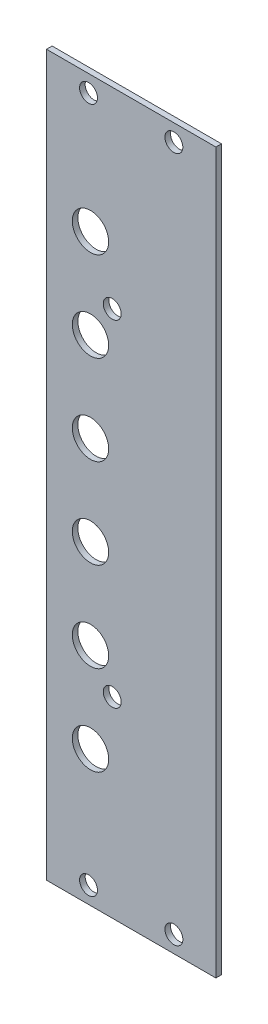
ISO-10303-21;
HEADER;
FILE_DESCRIPTION(('STEP AP214'),'2;1');
FILE_NAME('part.step','',(''),(''),'','','');
FILE_SCHEMA(('AUTOMOTIVE_DESIGN { 1 0 10303 214 1 1 1 1 }'));
ENDSEC;
DATA;
#1=APPLICATION_CONTEXT('core data for automotive mechanical design processes');
#2=APPLICATION_PROTOCOL_DEFINITION('international standard','automotive_design',2000,#1);
#3=PRODUCT_CONTEXT('',#1,'mechanical');
#4=PRODUCT('Part','Part','',(#3));
#5=PRODUCT_RELATED_PRODUCT_CATEGORY('part','',(#4));
#6=PRODUCT_DEFINITION_FORMATION('','',#4);
#7=PRODUCT_DEFINITION_CONTEXT('part definition',#1,'design');
#8=PRODUCT_DEFINITION('design','',#6,#7);
#9=PRODUCT_DEFINITION_SHAPE('','',#8);
#10=(LENGTH_UNIT() NAMED_UNIT(*) SI_UNIT(.MILLI.,.METRE.));
#11=(NAMED_UNIT(*) PLANE_ANGLE_UNIT() SI_UNIT($,.RADIAN.));
#12=(NAMED_UNIT(*) SI_UNIT($,.STERADIAN.) SOLID_ANGLE_UNIT());
#13=UNCERTAINTY_MEASURE_WITH_UNIT(LENGTH_MEASURE(1.E-05),#10,'distance_accuracy_value','');
#14=(GEOMETRIC_REPRESENTATION_CONTEXT(3) GLOBAL_UNCERTAINTY_ASSIGNED_CONTEXT((#13)) GLOBAL_UNIT_ASSIGNED_CONTEXT((#10,
#11,#12)) REPRESENTATION_CONTEXT('',''));
#15=CARTESIAN_POINT('',(0.,0.,0.));
#16=DIRECTION('',(0.,0.,1.));
#17=DIRECTION('',(1.,0.,0.));
#18=AXIS2_PLACEMENT_3D('',#15,#16,#17);
#19=CARTESIAN_POINT('',(0.,0.,1.));
#20=DIRECTION('',(0.,1.,0.));
#21=DIRECTION('',(0.,0.,1.));
#22=AXIS2_PLACEMENT_3D('',#19,#20,#21);
#23=PLANE('',#22);
#24=DIRECTION('',(1.,0.,0.));
#25=VECTOR('',#24,1.);
#26=CARTESIAN_POINT('',(0.,0.,0.));
#27=LINE('',#26,#25);
#28=CARTESIAN_POINT('',(0.,0.,0.));
#29=VERTEX_POINT('',#28);
#30=CARTESIAN_POINT('',(30.24,0.,0.));
#31=VERTEX_POINT('',#30);
#32=EDGE_CURVE('E127',#29,#31,#27,.T.);
#33=ORIENTED_EDGE('',*,*,#32,.T.);
#34=DIRECTION('',(0.,0.,-1.));
#35=VECTOR('',#34,1.);
#36=CARTESIAN_POINT('',(30.24,0.,1.));
#37=LINE('',#36,#35);
#38=CARTESIAN_POINT('',(30.24,0.,1.));
#39=VERTEX_POINT('',#38);
#40=EDGE_CURVE('E11',#39,#31,#37,.T.);
#41=ORIENTED_EDGE('',*,*,#40,.F.);
#42=DIRECTION('',(1.,0.,0.));
#43=VECTOR('',#42,1.);
#44=CARTESIAN_POINT('',(0.,0.,1.));
#45=LINE('',#44,#43);
#46=CARTESIAN_POINT('',(0.,0.,1.));
#47=VERTEX_POINT('',#46);
#48=EDGE_CURVE('E92',#47,#39,#45,.T.);
#49=ORIENTED_EDGE('',*,*,#48,.F.);
#50=DIRECTION('',(0.,0.,-1.));
#51=VECTOR('',#50,1.);
#52=CARTESIAN_POINT('',(0.,0.,1.));
#53=LINE('',#52,#51);
#54=EDGE_CURVE('E59',#47,#29,#53,.T.);
#55=ORIENTED_EDGE('',*,*,#54,.T.);
#56=EDGE_LOOP('',(#33,#41,#49,#55));
#57=FACE_BOUND('',#56,.T.);
#58=ADVANCED_FACE('F41',(#57),#23,.F.);
#59=CARTESIAN_POINT('',(30.24,0.,1.));
#60=DIRECTION('',(-1.,0.,0.));
#61=DIRECTION('',(0.,0.,1.));
#62=AXIS2_PLACEMENT_3D('',#59,#60,#61);
#63=PLANE('',#62);
#64=DIRECTION('',(0.,1.,0.));
#65=VECTOR('',#64,1.);
#66=CARTESIAN_POINT('',(30.24,0.,0.));
#67=LINE('',#66,#65);
#68=CARTESIAN_POINT('',(30.24,128.5,0.));
#69=VERTEX_POINT('',#68);
#70=EDGE_CURVE('E98',#31,#69,#67,.T.);
#71=ORIENTED_EDGE('',*,*,#70,.T.);
#72=DIRECTION('',(0.,0.,-1.));
#73=VECTOR('',#72,1.);
#74=CARTESIAN_POINT('',(30.24,128.5,1.));
#75=LINE('',#74,#73);
#76=CARTESIAN_POINT('',(30.24,128.5,1.));
#77=VERTEX_POINT('',#76);
#78=EDGE_CURVE('E51',#77,#69,#75,.T.);
#79=ORIENTED_EDGE('',*,*,#78,.F.);
#80=DIRECTION('',(0.,1.,0.));
#81=VECTOR('',#80,1.);
#82=CARTESIAN_POINT('',(30.24,0.,1.));
#83=LINE('',#82,#81);
#84=EDGE_CURVE('E84',#39,#77,#83,.T.);
#85=ORIENTED_EDGE('',*,*,#84,.F.);
#86=ORIENTED_EDGE('',*,*,#40,.T.);
#87=EDGE_LOOP('',(#71,#79,#85,#86));
#88=FACE_BOUND('',#87,.T.);
#89=ADVANCED_FACE('F97',(#88),#63,.F.);
#90=CARTESIAN_POINT('',(0.,128.5,1.));
#91=DIRECTION('',(0.,1.,0.));
#92=DIRECTION('',(0.,0.,1.));
#93=AXIS2_PLACEMENT_3D('',#90,#91,#92);
#94=PLANE('',#93);
#95=DIRECTION('',(1.,0.,0.));
#96=VECTOR('',#95,1.);
#97=CARTESIAN_POINT('',(0.,128.5,0.));
#98=LINE('',#97,#96);
#99=CARTESIAN_POINT('',(0.,128.5,0.));
#100=VERTEX_POINT('',#99);
#101=EDGE_CURVE('E132',#100,#69,#98,.T.);
#102=ORIENTED_EDGE('',*,*,#101,.F.);
#103=DIRECTION('',(0.,0.,-1.));
#104=VECTOR('',#103,1.);
#105=CARTESIAN_POINT('',(0.,128.5,1.));
#106=LINE('',#105,#104);
#107=CARTESIAN_POINT('',(0.,128.5,1.));
#108=VERTEX_POINT('',#107);
#109=EDGE_CURVE('E73',#108,#100,#106,.T.);
#110=ORIENTED_EDGE('',*,*,#109,.F.);
#111=DIRECTION('',(1.,0.,0.));
#112=VECTOR('',#111,1.);
#113=CARTESIAN_POINT('',(0.,128.5,1.));
#114=LINE('',#113,#112);
#115=EDGE_CURVE('E91',#108,#77,#114,.T.);
#116=ORIENTED_EDGE('',*,*,#115,.T.);
#117=ORIENTED_EDGE('',*,*,#78,.T.);
#118=EDGE_LOOP('',(#102,#110,#116,#117));
#119=FACE_BOUND('',#118,.T.);
#120=ADVANCED_FACE('F102',(#119),#94,.T.);
#121=CARTESIAN_POINT('',(7.49999999999999,125.5,1.));
#122=DIRECTION('',(0.,0.,-1.));
#123=DIRECTION('',(-1.,0.,0.));
#124=AXIS2_PLACEMENT_3D('',#121,#122,#123);
#125=CYLINDRICAL_SURFACE('',#124,1.6);
#126=CARTESIAN_POINT('',(7.49999999999999,125.5,1.));
#127=DIRECTION('',(0.,0.,1.));
#128=DIRECTION('',(1.,0.,0.));
#129=AXIS2_PLACEMENT_3D('',#126,#127,#128);
#130=CIRCLE('',#129,1.6);
#131=CARTESIAN_POINT('',(9.09999999999999,125.5,1.));
#132=VERTEX_POINT('',#131);
#133=EDGE_CURVE('E160',#132,#132,#130,.T.);
#134=ORIENTED_EDGE('',*,*,#133,.T.);
#135=EDGE_LOOP('',(#134));
#136=FACE_BOUND('',#135,.T.);
#137=CARTESIAN_POINT('',(7.49999999999999,125.5,0.));
#138=DIRECTION('',(0.,0.,1.));
#139=DIRECTION('',(1.,0.,0.));
#140=AXIS2_PLACEMENT_3D('',#137,#138,#139);
#141=CIRCLE('',#140,1.6);
#142=CARTESIAN_POINT('',(9.09999999999999,125.5,0.));
#143=VERTEX_POINT('',#142);
#144=EDGE_CURVE('E123',#143,#143,#141,.T.);
#145=ORIENTED_EDGE('',*,*,#144,.F.);
#146=EDGE_LOOP('',(#145));
#147=FACE_BOUND('',#146,.T.);
#148=ADVANCED_FACE('F166',(#136,#147),#125,.F.);
#149=CARTESIAN_POINT('',(22.74,125.5,1.));
#150=DIRECTION('',(0.,0.,-1.));
#151=DIRECTION('',(-1.,0.,0.));
#152=AXIS2_PLACEMENT_3D('',#149,#150,#151);
#153=CYLINDRICAL_SURFACE('',#152,1.59999999999999);
#154=CARTESIAN_POINT('',(22.74,125.5,1.));
#155=DIRECTION('',(0.,0.,1.));
#156=DIRECTION('',(1.,0.,0.));
#157=AXIS2_PLACEMENT_3D('',#154,#155,#156);
#158=CIRCLE('',#157,1.59999999999999);
#159=CARTESIAN_POINT('',(24.34,125.5,1.));
#160=VERTEX_POINT('',#159);
#161=EDGE_CURVE('E152',#160,#160,#158,.T.);
#162=ORIENTED_EDGE('',*,*,#161,.T.);
#163=EDGE_LOOP('',(#162));
#164=FACE_BOUND('',#163,.T.);
#165=CARTESIAN_POINT('',(22.74,125.5,0.));
#166=DIRECTION('',(0.,0.,1.));
#167=DIRECTION('',(1.,0.,0.));
#168=AXIS2_PLACEMENT_3D('',#165,#166,#167);
#169=CIRCLE('',#168,1.59999999999999);
#170=CARTESIAN_POINT('',(24.34,125.5,0.));
#171=VERTEX_POINT('',#170);
#172=EDGE_CURVE('E119',#171,#171,#169,.T.);
#173=ORIENTED_EDGE('',*,*,#172,.F.);
#174=EDGE_LOOP('',(#173));
#175=FACE_BOUND('',#174,.T.);
#176=ADVANCED_FACE('F195',(#164,#175),#153,.F.);
#177=CARTESIAN_POINT('',(22.74,3.,1.));
#178=DIRECTION('',(0.,0.,-1.));
#179=DIRECTION('',(-1.,0.,0.));
#180=AXIS2_PLACEMENT_3D('',#177,#178,#179);
#181=CYLINDRICAL_SURFACE('',#180,1.60000000000001);
#182=CARTESIAN_POINT('',(22.74,3.,1.));
#183=DIRECTION('',(0.,0.,1.));
#184=DIRECTION('',(1.,0.,0.));
#185=AXIS2_PLACEMENT_3D('',#182,#183,#184);
#186=CIRCLE('',#185,1.60000000000001);
#187=CARTESIAN_POINT('',(24.34,3.,1.));
#188=VERTEX_POINT('',#187);
#189=EDGE_CURVE('E146',#188,#188,#186,.T.);
#190=ORIENTED_EDGE('',*,*,#189,.T.);
#191=EDGE_LOOP('',(#190));
#192=FACE_BOUND('',#191,.T.);
#193=CARTESIAN_POINT('',(22.74,3.,0.));
#194=DIRECTION('',(0.,0.,1.));
#195=DIRECTION('',(1.,0.,0.));
#196=AXIS2_PLACEMENT_3D('',#193,#194,#195);
#197=CIRCLE('',#196,1.60000000000001);
#198=CARTESIAN_POINT('',(24.34,3.,0.));
#199=VERTEX_POINT('',#198);
#200=EDGE_CURVE('E114',#199,#199,#197,.T.);
#201=ORIENTED_EDGE('',*,*,#200,.F.);
#202=EDGE_LOOP('',(#201));
#203=FACE_BOUND('',#202,.T.);
#204=ADVANCED_FACE('F197',(#192,#203),#181,.F.);
#205=CARTESIAN_POINT('',(7.50000000000001,3.,1.));
#206=DIRECTION('',(0.,0.,-1.));
#207=DIRECTION('',(-1.,0.,0.));
#208=AXIS2_PLACEMENT_3D('',#205,#206,#207);
#209=CYLINDRICAL_SURFACE('',#208,1.6);
#210=CARTESIAN_POINT('',(7.50000000000001,3.,1.));
#211=DIRECTION('',(0.,0.,1.));
#212=DIRECTION('',(1.,0.,0.));
#213=AXIS2_PLACEMENT_3D('',#210,#211,#212);
#214=CIRCLE('',#213,1.6);
#215=CARTESIAN_POINT('',(9.10000000000001,3.,1.));
#216=VERTEX_POINT('',#215);
#217=EDGE_CURVE('E139',#216,#216,#214,.T.);
#218=ORIENTED_EDGE('',*,*,#217,.T.);
#219=EDGE_LOOP('',(#218));
#220=FACE_BOUND('',#219,.T.);
#221=CARTESIAN_POINT('',(7.50000000000001,3.,0.));
#222=DIRECTION('',(0.,0.,1.));
#223=DIRECTION('',(1.,0.,0.));
#224=AXIS2_PLACEMENT_3D('',#221,#222,#223);
#225=CIRCLE('',#224,1.6);
#226=CARTESIAN_POINT('',(9.10000000000001,3.,0.));
#227=VERTEX_POINT('',#226);
#228=EDGE_CURVE('E110',#227,#227,#225,.T.);
#229=ORIENTED_EDGE('',*,*,#228,.F.);
#230=EDGE_LOOP('',(#229));
#231=FACE_BOUND('',#230,.T.);
#232=ADVANCED_FACE('F43',(#220,#231),#209,.F.);
#233=CARTESIAN_POINT('',(0.,0.,1.));
#234=DIRECTION('',(-1.,0.,0.));
#235=DIRECTION('',(0.,0.,1.));
#236=AXIS2_PLACEMENT_3D('',#233,#234,#235);
#237=PLANE('',#236);
#238=DIRECTION('',(0.,1.,0.));
#239=VECTOR('',#238,1.);
#240=CARTESIAN_POINT('',(0.,0.,0.));
#241=LINE('',#240,#239);
#242=EDGE_CURVE('E135',#29,#100,#241,.T.);
#243=ORIENTED_EDGE('',*,*,#242,.F.);
#244=ORIENTED_EDGE('',*,*,#54,.F.);
#245=DIRECTION('',(0.,1.,0.));
#246=VECTOR('',#245,1.);
#247=CARTESIAN_POINT('',(0.,0.,1.));
#248=LINE('',#247,#246);
#249=EDGE_CURVE('E104',#47,#108,#248,.T.);
#250=ORIENTED_EDGE('',*,*,#249,.T.);
#251=ORIENTED_EDGE('',*,*,#109,.T.);
#252=EDGE_LOOP('',(#243,#244,#250,#251));
#253=FACE_BOUND('',#252,.T.);
#254=ADVANCED_FACE('F171',(#253),#237,.T.);
#255=CARTESIAN_POINT('',(0.,0.,1.));
#256=DIRECTION('',(0.,0.,1.));
#257=DIRECTION('',(1.,0.,0.));
#258=AXIS2_PLACEMENT_3D('',#255,#256,#257);
#259=PLANE('',#258);
#260=CARTESIAN_POINT('',(11.7314000000001,94.225,1.));
#261=DIRECTION('',(0.,0.,1.));
#262=DIRECTION('',(1.,0.,0.));
#263=AXIS2_PLACEMENT_3D('',#260,#261,#262);
#264=CIRCLE('',#263,1.6);
#265=CARTESIAN_POINT('',(13.3314000000001,94.225,1.));
#266=VERTEX_POINT('',#265);
#267=EDGE_CURVE('E319',#266,#266,#264,.T.);
#268=ORIENTED_EDGE('',*,*,#267,.F.);
#269=EDGE_LOOP('',(#268));
#270=FACE_BOUND('',#269,.T.);
#271=CARTESIAN_POINT('',(11.7314000000001,34.225,1.));
#272=DIRECTION('',(0.,0.,1.));
#273=DIRECTION('',(1.,0.,0.));
#274=AXIS2_PLACEMENT_3D('',#271,#272,#273);
#275=CIRCLE('',#274,1.6);
#276=CARTESIAN_POINT('',(13.3314000000001,34.225,1.));
#277=VERTEX_POINT('',#276);
#278=EDGE_CURVE('E324',#277,#277,#275,.T.);
#279=ORIENTED_EDGE('',*,*,#278,.F.);
#280=EDGE_LOOP('',(#279));
#281=FACE_BOUND('',#280,.T.);
#282=CARTESIAN_POINT('',(7.85000000000007,104.25,1.));
#283=DIRECTION('',(0.,0.,1.));
#284=DIRECTION('',(1.,0.,0.));
#285=AXIS2_PLACEMENT_3D('',#282,#283,#284);
#286=CIRCLE('',#285,3.25);
#287=CARTESIAN_POINT('',(11.1000000000001,104.25,1.));
#288=VERTEX_POINT('',#287);
#289=EDGE_CURVE('E115',#288,#288,#286,.T.);
#290=ORIENTED_EDGE('',*,*,#289,.F.);
#291=EDGE_LOOP('',(#290));
#292=FACE_BOUND('',#291,.T.);
#293=CARTESIAN_POINT('',(7.85000000000024,88.25,1.));
#294=DIRECTION('',(0.,0.,1.));
#295=DIRECTION('',(1.,0.,0.));
#296=AXIS2_PLACEMENT_3D('',#293,#294,#295);
#297=CIRCLE('',#296,3.25);
#298=CARTESIAN_POINT('',(11.1000000000002,88.25,1.));
#299=VERTEX_POINT('',#298);
#300=EDGE_CURVE('E375',#299,#299,#297,.T.);
#301=ORIENTED_EDGE('',*,*,#300,.F.);
#302=EDGE_LOOP('',(#301));
#303=FACE_BOUND('',#302,.T.);
#304=CARTESIAN_POINT('',(7.8500000000004,72.25,1.));
#305=DIRECTION('',(0.,0.,1.));
#306=DIRECTION('',(1.,0.,0.));
#307=AXIS2_PLACEMENT_3D('',#304,#305,#306);
#308=CIRCLE('',#307,3.25);
#309=CARTESIAN_POINT('',(11.1000000000004,72.25,1.));
#310=VERTEX_POINT('',#309);
#311=EDGE_CURVE('E372',#310,#310,#308,.T.);
#312=ORIENTED_EDGE('',*,*,#311,.F.);
#313=EDGE_LOOP('',(#312));
#314=FACE_BOUND('',#313,.T.);
#315=CARTESIAN_POINT('',(7.85000000000057,56.25,1.));
#316=DIRECTION('',(0.,0.,1.));
#317=DIRECTION('',(1.,0.,0.));
#318=AXIS2_PLACEMENT_3D('',#315,#316,#317);
#319=CIRCLE('',#318,3.25);
#320=CARTESIAN_POINT('',(11.1000000000006,56.25,1.));
#321=VERTEX_POINT('',#320);
#322=EDGE_CURVE('E368',#321,#321,#319,.T.);
#323=ORIENTED_EDGE('',*,*,#322,.F.);
#324=EDGE_LOOP('',(#323));
#325=FACE_BOUND('',#324,.T.);
#326=CARTESIAN_POINT('',(7.85000000000074,40.25,1.));
#327=DIRECTION('',(0.,0.,1.));
#328=DIRECTION('',(1.,0.,0.));
#329=AXIS2_PLACEMENT_3D('',#326,#327,#328);
#330=CIRCLE('',#329,3.25);
#331=CARTESIAN_POINT('',(11.1000000000007,40.25,1.));
#332=VERTEX_POINT('',#331);
#333=EDGE_CURVE('E364',#332,#332,#330,.T.);
#334=ORIENTED_EDGE('',*,*,#333,.F.);
#335=EDGE_LOOP('',(#334));
#336=FACE_BOUND('',#335,.T.);
#337=CARTESIAN_POINT('',(7.8500000000009,24.25,1.));
#338=DIRECTION('',(0.,0.,1.));
#339=DIRECTION('',(1.,0.,0.));
#340=AXIS2_PLACEMENT_3D('',#337,#338,#339);
#341=CIRCLE('',#340,3.25);
#342=CARTESIAN_POINT('',(11.1000000000009,24.25,1.));
#343=VERTEX_POINT('',#342);
#344=EDGE_CURVE('E341',#343,#343,#341,.T.);
#345=ORIENTED_EDGE('',*,*,#344,.F.);
#346=EDGE_LOOP('',(#345));
#347=FACE_BOUND('',#346,.T.);
#348=ORIENTED_EDGE('',*,*,#217,.F.);
#349=EDGE_LOOP('',(#348));
#350=FACE_BOUND('',#349,.T.);
#351=ORIENTED_EDGE('',*,*,#189,.F.);
#352=EDGE_LOOP('',(#351));
#353=FACE_BOUND('',#352,.T.);
#354=ORIENTED_EDGE('',*,*,#161,.F.);
#355=EDGE_LOOP('',(#354));
#356=FACE_BOUND('',#355,.T.);
#357=ORIENTED_EDGE('',*,*,#133,.F.);
#358=EDGE_LOOP('',(#357));
#359=FACE_BOUND('',#358,.T.);
#360=ORIENTED_EDGE('',*,*,#48,.T.);
#361=ORIENTED_EDGE('',*,*,#84,.T.);
#362=ORIENTED_EDGE('',*,*,#115,.F.);
#363=ORIENTED_EDGE('',*,*,#249,.F.);
#364=EDGE_LOOP('',(#360,#361,#362,#363));
#365=FACE_BOUND('',#364,.T.);
#366=ADVANCED_FACE('F88',(#270,#281,#292,#303,#314,#325,#336,#347,#350,#353,#356,#359,#365),
#259,.T.);
#367=CARTESIAN_POINT('',(0.,0.,0.));
#368=DIRECTION('',(0.,0.,1.));
#369=DIRECTION('',(1.,0.,0.));
#370=AXIS2_PLACEMENT_3D('',#367,#368,#369);
#371=PLANE('',#370);
#372=CARTESIAN_POINT('',(11.7314000000001,94.225,0.));
#373=DIRECTION('',(0.,0.,1.));
#374=DIRECTION('',(1.,0.,0.));
#375=AXIS2_PLACEMENT_3D('',#372,#373,#374);
#376=CIRCLE('',#375,1.6);
#377=CARTESIAN_POINT('',(13.3314000000001,94.225,0.));
#378=VERTEX_POINT('',#377);
#379=EDGE_CURVE('E322',#378,#378,#376,.T.);
#380=ORIENTED_EDGE('',*,*,#379,.T.);
#381=EDGE_LOOP('',(#380));
#382=FACE_BOUND('',#381,.T.);
#383=CARTESIAN_POINT('',(11.7314000000001,34.225,0.));
#384=DIRECTION('',(0.,0.,1.));
#385=DIRECTION('',(1.,0.,0.));
#386=AXIS2_PLACEMENT_3D('',#383,#384,#385);
#387=CIRCLE('',#386,1.6);
#388=CARTESIAN_POINT('',(13.3314000000001,34.225,0.));
#389=VERTEX_POINT('',#388);
#390=EDGE_CURVE('E325',#389,#389,#387,.T.);
#391=ORIENTED_EDGE('',*,*,#390,.T.);
#392=EDGE_LOOP('',(#391));
#393=FACE_BOUND('',#392,.T.);
#394=CARTESIAN_POINT('',(7.85000000000007,104.25,0.));
#395=DIRECTION('',(0.,0.,1.));
#396=DIRECTION('',(1.,0.,0.));
#397=AXIS2_PLACEMENT_3D('',#394,#395,#396);
#398=CIRCLE('',#397,3.25);
#399=CARTESIAN_POINT('',(11.1000000000001,104.25,0.));
#400=VERTEX_POINT('',#399);
#401=EDGE_CURVE('E337',#400,#400,#398,.T.);
#402=ORIENTED_EDGE('',*,*,#401,.T.);
#403=EDGE_LOOP('',(#402));
#404=FACE_BOUND('',#403,.T.);
#405=CARTESIAN_POINT('',(7.85000000000024,88.25,0.));
#406=DIRECTION('',(0.,0.,1.));
#407=DIRECTION('',(1.,0.,0.));
#408=AXIS2_PLACEMENT_3D('',#405,#406,#407);
#409=CIRCLE('',#408,3.25);
#410=CARTESIAN_POINT('',(11.1000000000002,88.25,0.));
#411=VERTEX_POINT('',#410);
#412=EDGE_CURVE('E342',#411,#411,#409,.T.);
#413=ORIENTED_EDGE('',*,*,#412,.T.);
#414=EDGE_LOOP('',(#413));
#415=FACE_BOUND('',#414,.T.);
#416=CARTESIAN_POINT('',(7.8500000000004,72.25,0.));
#417=DIRECTION('',(0.,0.,1.));
#418=DIRECTION('',(1.,0.,0.));
#419=AXIS2_PLACEMENT_3D('',#416,#417,#418);
#420=CIRCLE('',#419,3.25);
#421=CARTESIAN_POINT('',(11.1000000000004,72.25,0.));
#422=VERTEX_POINT('',#421);
#423=EDGE_CURVE('E346',#422,#422,#420,.T.);
#424=ORIENTED_EDGE('',*,*,#423,.T.);
#425=EDGE_LOOP('',(#424));
#426=FACE_BOUND('',#425,.T.);
#427=CARTESIAN_POINT('',(7.85000000000057,56.25,0.));
#428=DIRECTION('',(0.,0.,1.));
#429=DIRECTION('',(1.,0.,0.));
#430=AXIS2_PLACEMENT_3D('',#427,#428,#429);
#431=CIRCLE('',#430,3.25);
#432=CARTESIAN_POINT('',(11.1000000000006,56.25,0.));
#433=VERTEX_POINT('',#432);
#434=EDGE_CURVE('E350',#433,#433,#431,.T.);
#435=ORIENTED_EDGE('',*,*,#434,.T.);
#436=EDGE_LOOP('',(#435));
#437=FACE_BOUND('',#436,.T.);
#438=CARTESIAN_POINT('',(7.85000000000074,40.25,0.));
#439=DIRECTION('',(0.,0.,1.));
#440=DIRECTION('',(1.,0.,0.));
#441=AXIS2_PLACEMENT_3D('',#438,#439,#440);
#442=CIRCLE('',#441,3.25);
#443=CARTESIAN_POINT('',(11.1000000000007,40.25,0.));
#444=VERTEX_POINT('',#443);
#445=EDGE_CURVE('E354',#444,#444,#442,.T.);
#446=ORIENTED_EDGE('',*,*,#445,.T.);
#447=EDGE_LOOP('',(#446));
#448=FACE_BOUND('',#447,.T.);
#449=CARTESIAN_POINT('',(7.8500000000009,24.25,0.));
#450=DIRECTION('',(0.,0.,1.));
#451=DIRECTION('',(1.,0.,0.));
#452=AXIS2_PLACEMENT_3D('',#449,#450,#451);
#453=CIRCLE('',#452,3.25);
#454=CARTESIAN_POINT('',(11.1000000000009,24.25,0.));
#455=VERTEX_POINT('',#454);
#456=EDGE_CURVE('E336',#455,#455,#453,.T.);
#457=ORIENTED_EDGE('',*,*,#456,.T.);
#458=EDGE_LOOP('',(#457));
#459=FACE_BOUND('',#458,.T.);
#460=ORIENTED_EDGE('',*,*,#228,.T.);
#461=EDGE_LOOP('',(#460));
#462=FACE_BOUND('',#461,.T.);
#463=ORIENTED_EDGE('',*,*,#200,.T.);
#464=EDGE_LOOP('',(#463));
#465=FACE_BOUND('',#464,.T.);
#466=ORIENTED_EDGE('',*,*,#172,.T.);
#467=EDGE_LOOP('',(#466));
#468=FACE_BOUND('',#467,.T.);
#469=ORIENTED_EDGE('',*,*,#144,.T.);
#470=EDGE_LOOP('',(#469));
#471=FACE_BOUND('',#470,.T.);
#472=ORIENTED_EDGE('',*,*,#32,.F.);
#473=ORIENTED_EDGE('',*,*,#242,.T.);
#474=ORIENTED_EDGE('',*,*,#101,.T.);
#475=ORIENTED_EDGE('',*,*,#70,.F.);
#476=EDGE_LOOP('',(#472,#473,#474,#475));
#477=FACE_BOUND('',#476,.T.);
#478=ADVANCED_FACE('F170',(#382,#393,#404,#415,#426,#437,#448,#459,#462,#465,#468,#471,#477),
#371,.F.);
#479=CARTESIAN_POINT('',(7.8500000000009,24.25,0.));
#480=DIRECTION('',(0.,0.,1.));
#481=DIRECTION('',(1.,0.,0.));
#482=AXIS2_PLACEMENT_3D('',#479,#480,#481);
#483=CYLINDRICAL_SURFACE('',#482,3.25);
#484=ORIENTED_EDGE('',*,*,#344,.T.);
#485=EDGE_LOOP('',(#484));
#486=FACE_BOUND('',#485,.T.);
#487=ORIENTED_EDGE('',*,*,#456,.F.);
#488=EDGE_LOOP('',(#487));
#489=FACE_BOUND('',#488,.T.);
#490=ADVANCED_FACE('F178',(#486,#489),#483,.F.);
#491=CARTESIAN_POINT('',(7.85000000000074,40.25,0.));
#492=DIRECTION('',(0.,0.,1.));
#493=DIRECTION('',(1.,0.,0.));
#494=AXIS2_PLACEMENT_3D('',#491,#492,#493);
#495=CYLINDRICAL_SURFACE('',#494,3.25);
#496=ORIENTED_EDGE('',*,*,#333,.T.);
#497=EDGE_LOOP('',(#496));
#498=FACE_BOUND('',#497,.T.);
#499=ORIENTED_EDGE('',*,*,#445,.F.);
#500=EDGE_LOOP('',(#499));
#501=FACE_BOUND('',#500,.T.);
#502=ADVANCED_FACE('F235',(#498,#501),#495,.F.);
#503=CARTESIAN_POINT('',(7.85000000000057,56.25,0.));
#504=DIRECTION('',(0.,0.,1.));
#505=DIRECTION('',(1.,0.,0.));
#506=AXIS2_PLACEMENT_3D('',#503,#504,#505);
#507=CYLINDRICAL_SURFACE('',#506,3.25);
#508=ORIENTED_EDGE('',*,*,#322,.T.);
#509=EDGE_LOOP('',(#508));
#510=FACE_BOUND('',#509,.T.);
#511=ORIENTED_EDGE('',*,*,#434,.F.);
#512=EDGE_LOOP('',(#511));
#513=FACE_BOUND('',#512,.T.);
#514=ADVANCED_FACE('F245',(#510,#513),#507,.F.);
#515=CARTESIAN_POINT('',(7.8500000000004,72.25,0.));
#516=DIRECTION('',(0.,0.,1.));
#517=DIRECTION('',(1.,0.,0.));
#518=AXIS2_PLACEMENT_3D('',#515,#516,#517);
#519=CYLINDRICAL_SURFACE('',#518,3.25);
#520=ORIENTED_EDGE('',*,*,#311,.T.);
#521=EDGE_LOOP('',(#520));
#522=FACE_BOUND('',#521,.T.);
#523=ORIENTED_EDGE('',*,*,#423,.F.);
#524=EDGE_LOOP('',(#523));
#525=FACE_BOUND('',#524,.T.);
#526=ADVANCED_FACE('F255',(#522,#525),#519,.F.);
#527=CARTESIAN_POINT('',(7.85000000000024,88.25,0.));
#528=DIRECTION('',(0.,0.,1.));
#529=DIRECTION('',(1.,0.,0.));
#530=AXIS2_PLACEMENT_3D('',#527,#528,#529);
#531=CYLINDRICAL_SURFACE('',#530,3.25);
#532=ORIENTED_EDGE('',*,*,#300,.T.);
#533=EDGE_LOOP('',(#532));
#534=FACE_BOUND('',#533,.T.);
#535=ORIENTED_EDGE('',*,*,#412,.F.);
#536=EDGE_LOOP('',(#535));
#537=FACE_BOUND('',#536,.T.);
#538=ADVANCED_FACE('F265',(#534,#537),#531,.F.);
#539=CARTESIAN_POINT('',(7.85000000000007,104.25,0.));
#540=DIRECTION('',(0.,0.,1.));
#541=DIRECTION('',(1.,0.,0.));
#542=AXIS2_PLACEMENT_3D('',#539,#540,#541);
#543=CYLINDRICAL_SURFACE('',#542,3.25);
#544=ORIENTED_EDGE('',*,*,#289,.T.);
#545=EDGE_LOOP('',(#544));
#546=FACE_BOUND('',#545,.T.);
#547=ORIENTED_EDGE('',*,*,#401,.F.);
#548=EDGE_LOOP('',(#547));
#549=FACE_BOUND('',#548,.T.);
#550=ADVANCED_FACE('F275',(#546,#549),#543,.F.);
#551=CARTESIAN_POINT('',(11.7314000000001,34.225,0.));
#552=DIRECTION('',(0.,0.,1.));
#553=DIRECTION('',(1.,0.,0.));
#554=AXIS2_PLACEMENT_3D('',#551,#552,#553);
#555=CYLINDRICAL_SURFACE('',#554,1.6);
#556=ORIENTED_EDGE('',*,*,#278,.T.);
#557=EDGE_LOOP('',(#556));
#558=FACE_BOUND('',#557,.T.);
#559=ORIENTED_EDGE('',*,*,#390,.F.);
#560=EDGE_LOOP('',(#559));
#561=FACE_BOUND('',#560,.T.);
#562=ADVANCED_FACE('F284',(#558,#561),#555,.F.);
#563=CARTESIAN_POINT('',(11.7314000000001,94.225,0.));
#564=DIRECTION('',(0.,0.,1.));
#565=DIRECTION('',(1.,0.,0.));
#566=AXIS2_PLACEMENT_3D('',#563,#564,#565);
#567=CYLINDRICAL_SURFACE('',#566,1.6);
#568=ORIENTED_EDGE('',*,*,#267,.T.);
#569=EDGE_LOOP('',(#568));
#570=FACE_BOUND('',#569,.T.);
#571=ORIENTED_EDGE('',*,*,#379,.F.);
#572=EDGE_LOOP('',(#571));
#573=FACE_BOUND('',#572,.T.);
#574=ADVANCED_FACE('F303',(#570,#573),#567,.F.);
#575=CLOSED_SHELL('',(#58,#89,#120,#148,#176,#204,#232,#254,#366,#478,#490,#502,#514,#526,#538,
#550,#562,#574));
#576=MANIFOLD_SOLID_BREP('B2',#575);
#577=ADVANCED_BREP_SHAPE_REPRESENTATION('',(#18,#576),#14);
#578=SHAPE_DEFINITION_REPRESENTATION(#9,#577);
ENDSEC;
END-ISO-10303-21;
